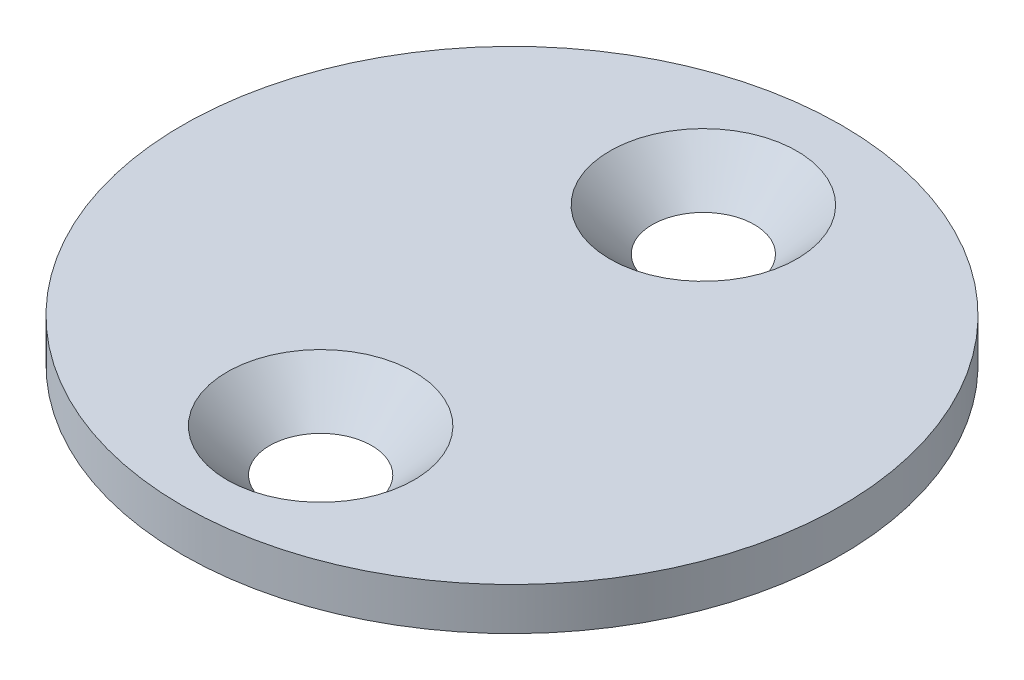
ISO-10303-21;
HEADER;
FILE_DESCRIPTION(('STEP AP214'),'2;1');
FILE_NAME('part.step','',(''),(''),'','','');
FILE_SCHEMA(('AUTOMOTIVE_DESIGN { 1 0 10303 214 1 1 1 1 }'));
ENDSEC;
DATA;
#1=APPLICATION_CONTEXT('core data for automotive mechanical design processes');
#2=APPLICATION_PROTOCOL_DEFINITION('international standard','automotive_design',2000,#1);
#3=PRODUCT_CONTEXT('',#1,'mechanical');
#4=PRODUCT('Part','Part','',(#3));
#5=PRODUCT_RELATED_PRODUCT_CATEGORY('part','',(#4));
#6=PRODUCT_DEFINITION_FORMATION('','',#4);
#7=PRODUCT_DEFINITION_CONTEXT('part definition',#1,'design');
#8=PRODUCT_DEFINITION('design','',#6,#7);
#9=PRODUCT_DEFINITION_SHAPE('','',#8);
#10=(LENGTH_UNIT() NAMED_UNIT(*) SI_UNIT(.MILLI.,.METRE.));
#11=(NAMED_UNIT(*) PLANE_ANGLE_UNIT() SI_UNIT($,.RADIAN.));
#12=(NAMED_UNIT(*) SI_UNIT($,.STERADIAN.) SOLID_ANGLE_UNIT());
#13=UNCERTAINTY_MEASURE_WITH_UNIT(LENGTH_MEASURE(1.E-05),#10,'distance_accuracy_value','');
#14=(GEOMETRIC_REPRESENTATION_CONTEXT(3) GLOBAL_UNCERTAINTY_ASSIGNED_CONTEXT((#13)) GLOBAL_UNIT_ASSIGNED_CONTEXT((#10,
#11,#12)) REPRESENTATION_CONTEXT('',''));
#15=CARTESIAN_POINT('',(0.,0.,0.));
#16=DIRECTION('',(0.,0.,1.));
#17=DIRECTION('',(1.,0.,0.));
#18=AXIS2_PLACEMENT_3D('',#15,#16,#17);
#19=CARTESIAN_POINT('',(0.,1.,0.));
#20=DIRECTION('',(0.,-1.,0.));
#21=DIRECTION('',(0.,0.,-1.));
#22=AXIS2_PLACEMENT_3D('',#19,#20,#21);
#23=CYLINDRICAL_SURFACE('',#22,7.75);
#24=CARTESIAN_POINT('',(0.,1.,0.));
#25=DIRECTION('',(0.,1.,0.));
#26=DIRECTION('',(0.,0.,1.));
#27=AXIS2_PLACEMENT_3D('',#24,#25,#26);
#28=CIRCLE('',#27,7.75);
#29=CARTESIAN_POINT('',(0.,1.,7.75));
#30=VERTEX_POINT('',#29);
#31=EDGE_CURVE('E10',#30,#30,#28,.T.);
#32=ORIENTED_EDGE('',*,*,#31,.F.);
#33=EDGE_LOOP('',(#32));
#34=FACE_BOUND('',#33,.T.);
#35=CARTESIAN_POINT('',(0.,0.,0.));
#36=DIRECTION('',(0.,1.,0.));
#37=DIRECTION('',(0.,0.,1.));
#38=AXIS2_PLACEMENT_3D('',#35,#36,#37);
#39=CIRCLE('',#38,7.75);
#40=CARTESIAN_POINT('',(0.,0.,7.75));
#41=VERTEX_POINT('',#40);
#42=EDGE_CURVE('E40',#41,#41,#39,.T.);
#43=ORIENTED_EDGE('',*,*,#42,.T.);
#44=EDGE_LOOP('',(#43));
#45=FACE_BOUND('',#44,.T.);
#46=ADVANCED_FACE('F37',(#34,#45),#23,.T.);
#47=CARTESIAN_POINT('',(0.,1.,0.));
#48=DIRECTION('',(0.,1.,0.));
#49=DIRECTION('',(0.,0.,1.));
#50=AXIS2_PLACEMENT_3D('',#47,#48,#49);
#51=PLANE('',#50);
#52=CARTESIAN_POINT('',(0.,1.,4.5));
#53=DIRECTION('',(0.,1.,0.));
#54=DIRECTION('',(0.,0.,1.));
#55=AXIS2_PLACEMENT_3D('',#52,#53,#54);
#56=CIRCLE('',#55,2.2);
#57=CARTESIAN_POINT('',(0.,1.,6.7));
#58=VERTEX_POINT('',#57);
#59=EDGE_CURVE('E62',#58,#58,#56,.T.);
#60=ORIENTED_EDGE('',*,*,#59,.F.);
#61=EDGE_LOOP('',(#60));
#62=FACE_BOUND('',#61,.T.);
#63=CARTESIAN_POINT('',(0.,1.,-4.5));
#64=DIRECTION('',(0.,1.,0.));
#65=DIRECTION('',(0.,0.,1.));
#66=AXIS2_PLACEMENT_3D('',#63,#64,#65);
#67=CIRCLE('',#66,2.2);
#68=CARTESIAN_POINT('',(0.,1.,-2.3));
#69=VERTEX_POINT('',#68);
#70=EDGE_CURVE('E54',#69,#69,#67,.T.);
#71=ORIENTED_EDGE('',*,*,#70,.F.);
#72=EDGE_LOOP('',(#71));
#73=FACE_BOUND('',#72,.T.);
#74=ORIENTED_EDGE('',*,*,#31,.T.);
#75=EDGE_LOOP('',(#74));
#76=FACE_BOUND('',#75,.T.);
#77=ADVANCED_FACE('F69',(#62,#73,#76),#51,.T.);
#78=CARTESIAN_POINT('',(0.,0.,0.));
#79=DIRECTION('',(0.,1.,0.));
#80=DIRECTION('',(0.,0.,1.));
#81=AXIS2_PLACEMENT_3D('',#78,#79,#80);
#82=PLANE('',#81);
#83=CARTESIAN_POINT('',(0.,0.,4.5));
#84=DIRECTION('',(0.,1.,0.));
#85=DIRECTION('',(0.,0.,1.));
#86=AXIS2_PLACEMENT_3D('',#83,#84,#85);
#87=CIRCLE('',#86,1.2);
#88=CARTESIAN_POINT('',(0.,0.,5.7));
#89=VERTEX_POINT('',#88);
#90=EDGE_CURVE('E58',#89,#89,#87,.T.);
#91=ORIENTED_EDGE('',*,*,#90,.T.);
#92=EDGE_LOOP('',(#91));
#93=FACE_BOUND('',#92,.T.);
#94=CARTESIAN_POINT('',(0.,0.,-4.5));
#95=DIRECTION('',(0.,1.,0.));
#96=DIRECTION('',(0.,0.,1.));
#97=AXIS2_PLACEMENT_3D('',#94,#95,#96);
#98=CIRCLE('',#97,1.2);
#99=CARTESIAN_POINT('',(0.,0.,-3.3));
#100=VERTEX_POINT('',#99);
#101=EDGE_CURVE('E49',#100,#100,#98,.T.);
#102=ORIENTED_EDGE('',*,*,#101,.T.);
#103=EDGE_LOOP('',(#102));
#104=FACE_BOUND('',#103,.T.);
#105=ORIENTED_EDGE('',*,*,#42,.F.);
#106=EDGE_LOOP('',(#105));
#107=FACE_BOUND('',#106,.T.);
#108=ADVANCED_FACE('F72',(#93,#104,#107),#82,.F.);
#109=CARTESIAN_POINT('',(0.,1.,-4.5));
#110=DIRECTION('',(0.,1.,0.));
#111=DIRECTION('',(0.,0.,1.));
#112=AXIS2_PLACEMENT_3D('',#109,#110,#111);
#113=CONICAL_SURFACE('',#112,2.2,0.785398163397448);
#114=ORIENTED_EDGE('',*,*,#101,.F.);
#115=EDGE_LOOP('',(#114));
#116=FACE_BOUND('',#115,.T.);
#117=ORIENTED_EDGE('',*,*,#70,.T.);
#118=EDGE_LOOP('',(#117));
#119=FACE_BOUND('',#118,.T.);
#120=ADVANCED_FACE('F76',(#116,#119),#113,.F.);
#121=CARTESIAN_POINT('',(0.,1.,4.5));
#122=DIRECTION('',(0.,1.,0.));
#123=DIRECTION('',(0.,0.,1.));
#124=AXIS2_PLACEMENT_3D('',#121,#122,#123);
#125=CONICAL_SURFACE('',#124,2.2,0.785398163397448);
#126=ORIENTED_EDGE('',*,*,#90,.F.);
#127=EDGE_LOOP('',(#126));
#128=FACE_BOUND('',#127,.T.);
#129=ORIENTED_EDGE('',*,*,#59,.T.);
#130=EDGE_LOOP('',(#129));
#131=FACE_BOUND('',#130,.T.);
#132=ADVANCED_FACE('F67',(#128,#131),#125,.F.);
#133=CLOSED_SHELL('',(#46,#77,#108,#120,#132));
#134=MANIFOLD_SOLID_BREP('B2',#133);
#135=ADVANCED_BREP_SHAPE_REPRESENTATION('',(#18,#134),#14);
#136=SHAPE_DEFINITION_REPRESENTATION(#9,#135);
ENDSEC;
END-ISO-10303-21;
